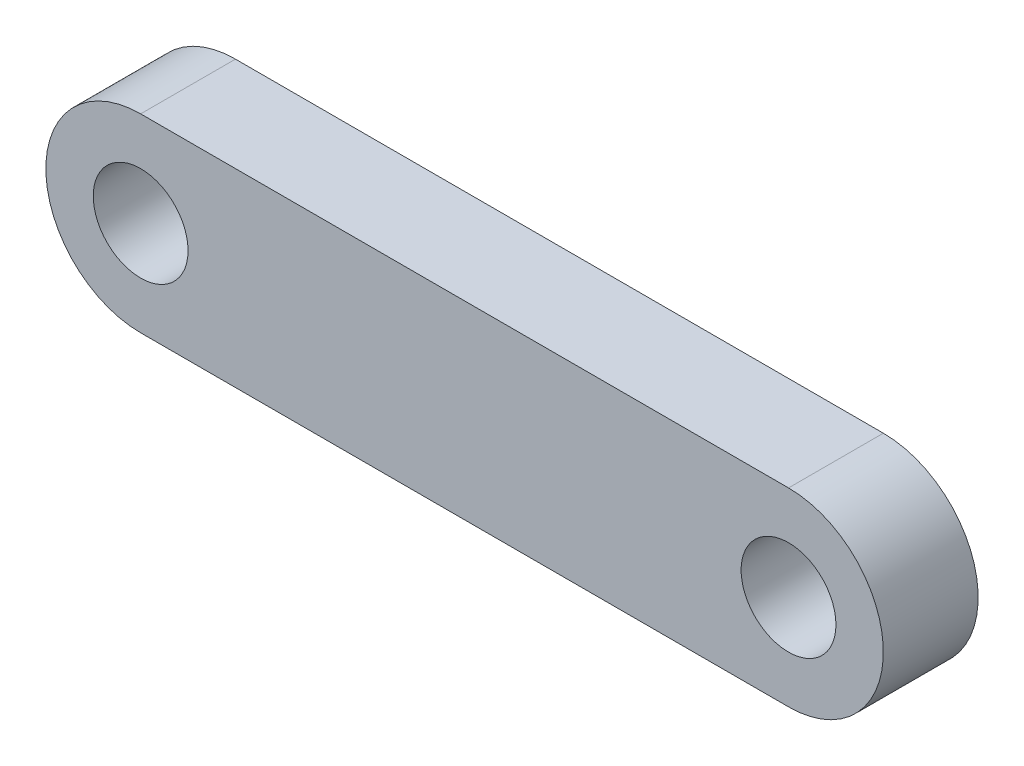
ISO-10303-21;
HEADER;
FILE_DESCRIPTION(('STEP AP214'),'2;1');
FILE_NAME('part.step','',(''),(''),'','','');
FILE_SCHEMA(('AUTOMOTIVE_DESIGN { 1 0 10303 214 1 1 1 1 }'));
ENDSEC;
DATA;
#1=APPLICATION_CONTEXT('core data for automotive mechanical design processes');
#2=APPLICATION_PROTOCOL_DEFINITION('international standard','automotive_design',2000,#1);
#3=PRODUCT_CONTEXT('',#1,'mechanical');
#4=PRODUCT('Part','Part','',(#3));
#5=PRODUCT_RELATED_PRODUCT_CATEGORY('part','',(#4));
#6=PRODUCT_DEFINITION_FORMATION('','',#4);
#7=PRODUCT_DEFINITION_CONTEXT('part definition',#1,'design');
#8=PRODUCT_DEFINITION('design','',#6,#7);
#9=PRODUCT_DEFINITION_SHAPE('','',#8);
#10=(LENGTH_UNIT() NAMED_UNIT(*) SI_UNIT(.MILLI.,.METRE.));
#11=(NAMED_UNIT(*) PLANE_ANGLE_UNIT() SI_UNIT($,.RADIAN.));
#12=(NAMED_UNIT(*) SI_UNIT($,.STERADIAN.) SOLID_ANGLE_UNIT());
#13=UNCERTAINTY_MEASURE_WITH_UNIT(LENGTH_MEASURE(1.E-05),#10,'distance_accuracy_value','');
#14=(GEOMETRIC_REPRESENTATION_CONTEXT(3) GLOBAL_UNCERTAINTY_ASSIGNED_CONTEXT((#13)) GLOBAL_UNIT_ASSIGNED_CONTEXT((#10,
#11,#12)) REPRESENTATION_CONTEXT('',''));
#15=CARTESIAN_POINT('',(0.,0.,0.));
#16=DIRECTION('',(0.,0.,1.));
#17=DIRECTION('',(1.,0.,0.));
#18=AXIS2_PLACEMENT_3D('',#15,#16,#17);
#19=CARTESIAN_POINT('',(0.,0.,3.));
#20=DIRECTION('',(0.,0.,1.));
#21=DIRECTION('',(1.,0.,0.));
#22=AXIS2_PLACEMENT_3D('',#19,#20,#21);
#23=PLANE('',#22);
#24=CARTESIAN_POINT('',(0.,0.,3.));
#25=DIRECTION('',(0.,0.,1.));
#26=DIRECTION('',(1.,0.,0.));
#27=AXIS2_PLACEMENT_3D('',#24,#25,#26);
#28=CIRCLE('',#27,1.5);
#29=CARTESIAN_POINT('',(1.5,0.,3.));
#30=VERTEX_POINT('',#29);
#31=EDGE_CURVE('E101',#30,#30,#28,.T.);
#32=ORIENTED_EDGE('',*,*,#31,.F.);
#33=EDGE_LOOP('',(#32));
#34=FACE_BOUND('',#33,.T.);
#35=CARTESIAN_POINT('',(0.,0.,3.));
#36=DIRECTION('',(0.,0.,1.));
#37=DIRECTION('',(1.,0.,0.));
#38=AXIS2_PLACEMENT_3D('',#35,#36,#37);
#39=CIRCLE('',#38,3.);
#40=CARTESIAN_POINT('',(0.,3.,3.));
#41=VERTEX_POINT('',#40);
#42=CARTESIAN_POINT('',(0.,-3.,3.));
#43=VERTEX_POINT('',#42);
#44=EDGE_CURVE('E86',#41,#43,#39,.T.);
#45=ORIENTED_EDGE('',*,*,#44,.T.);
#46=DIRECTION('',(1.,0.,0.));
#47=VECTOR('',#46,1.);
#48=CARTESIAN_POINT('',(0.,-3.,3.));
#49=LINE('',#48,#47);
#50=CARTESIAN_POINT('',(20.5,-3.,3.));
#51=VERTEX_POINT('',#50);
#52=EDGE_CURVE('E81',#43,#51,#49,.T.);
#53=ORIENTED_EDGE('',*,*,#52,.T.);
#54=CARTESIAN_POINT('',(20.5,0.,3.));
#55=DIRECTION('',(0.,0.,1.));
#56=DIRECTION('',(1.,0.,0.));
#57=AXIS2_PLACEMENT_3D('',#54,#55,#56);
#58=CIRCLE('',#57,3.);
#59=CARTESIAN_POINT('',(20.5,3.,3.));
#60=VERTEX_POINT('',#59);
#61=EDGE_CURVE('E84',#51,#60,#58,.T.);
#62=ORIENTED_EDGE('',*,*,#61,.T.);
#63=DIRECTION('',(-1.,0.,0.));
#64=VECTOR('',#63,1.);
#65=CARTESIAN_POINT('',(0.,3.,3.));
#66=LINE('',#65,#64);
#67=EDGE_CURVE('E51',#60,#41,#66,.T.);
#68=ORIENTED_EDGE('',*,*,#67,.T.);
#69=EDGE_LOOP('',(#45,#53,#62,#68));
#70=FACE_BOUND('',#69,.T.);
#71=CARTESIAN_POINT('',(20.5,0.,3.));
#72=DIRECTION('',(0.,0.,1.));
#73=DIRECTION('',(1.,0.,0.));
#74=AXIS2_PLACEMENT_3D('',#71,#72,#73);
#75=CIRCLE('',#74,1.5);
#76=CARTESIAN_POINT('',(22.,0.,3.));
#77=VERTEX_POINT('',#76);
#78=EDGE_CURVE('E116',#77,#77,#75,.T.);
#79=ORIENTED_EDGE('',*,*,#78,.F.);
#80=EDGE_LOOP('',(#79));
#81=FACE_BOUND('',#80,.T.);
#82=ADVANCED_FACE('F34',(#34,#70,#81),#23,.T.);
#83=CARTESIAN_POINT('',(0.,0.,0.));
#84=DIRECTION('',(0.,0.,1.));
#85=DIRECTION('',(1.,0.,0.));
#86=AXIS2_PLACEMENT_3D('',#83,#84,#85);
#87=PLANE('',#86);
#88=CARTESIAN_POINT('',(0.,0.,0.));
#89=DIRECTION('',(0.,0.,1.));
#90=DIRECTION('',(1.,0.,0.));
#91=AXIS2_PLACEMENT_3D('',#88,#89,#90);
#92=CIRCLE('',#91,3.);
#93=CARTESIAN_POINT('',(0.,3.,0.));
#94=VERTEX_POINT('',#93);
#95=CARTESIAN_POINT('',(0.,-3.,0.));
#96=VERTEX_POINT('',#95);
#97=EDGE_CURVE('E98',#94,#96,#92,.T.);
#98=ORIENTED_EDGE('',*,*,#97,.F.);
#99=DIRECTION('',(-1.,0.,0.));
#100=VECTOR('',#99,1.);
#101=CARTESIAN_POINT('',(0.,3.,0.));
#102=LINE('',#101,#100);
#103=CARTESIAN_POINT('',(20.5,3.,0.));
#104=VERTEX_POINT('',#103);
#105=EDGE_CURVE('E74',#104,#94,#102,.T.);
#106=ORIENTED_EDGE('',*,*,#105,.F.);
#107=CARTESIAN_POINT('',(20.5,0.,0.));
#108=DIRECTION('',(0.,0.,1.));
#109=DIRECTION('',(1.,0.,0.));
#110=AXIS2_PLACEMENT_3D('',#107,#108,#109);
#111=CIRCLE('',#110,3.);
#112=CARTESIAN_POINT('',(20.5,-3.,0.));
#113=VERTEX_POINT('',#112);
#114=EDGE_CURVE('E68',#113,#104,#111,.T.);
#115=ORIENTED_EDGE('',*,*,#114,.F.);
#116=DIRECTION('',(1.,0.,0.));
#117=VECTOR('',#116,1.);
#118=CARTESIAN_POINT('',(0.,-3.,0.));
#119=LINE('',#118,#117);
#120=EDGE_CURVE('E90',#96,#113,#119,.T.);
#121=ORIENTED_EDGE('',*,*,#120,.F.);
#122=EDGE_LOOP('',(#98,#106,#115,#121));
#123=FACE_BOUND('',#122,.T.);
#124=CARTESIAN_POINT('',(0.,0.,0.));
#125=DIRECTION('',(0.,0.,1.));
#126=DIRECTION('',(1.,0.,0.));
#127=AXIS2_PLACEMENT_3D('',#124,#125,#126);
#128=CIRCLE('',#127,1.5);
#129=CARTESIAN_POINT('',(1.5,0.,0.));
#130=VERTEX_POINT('',#129);
#131=EDGE_CURVE('E113',#130,#130,#128,.T.);
#132=ORIENTED_EDGE('',*,*,#131,.T.);
#133=EDGE_LOOP('',(#132));
#134=FACE_BOUND('',#133,.T.);
#135=CARTESIAN_POINT('',(20.5,0.,0.));
#136=DIRECTION('',(0.,0.,1.));
#137=DIRECTION('',(1.,0.,0.));
#138=AXIS2_PLACEMENT_3D('',#135,#136,#137);
#139=CIRCLE('',#138,1.5);
#140=CARTESIAN_POINT('',(22.,0.,0.));
#141=VERTEX_POINT('',#140);
#142=EDGE_CURVE('E119',#141,#141,#139,.T.);
#143=ORIENTED_EDGE('',*,*,#142,.T.);
#144=EDGE_LOOP('',(#143));
#145=FACE_BOUND('',#144,.T.);
#146=ADVANCED_FACE('F109',(#123,#134,#145),#87,.F.);
#147=CARTESIAN_POINT('',(0.,0.,3.));
#148=DIRECTION('',(0.,0.,-1.));
#149=DIRECTION('',(-1.,0.,0.));
#150=AXIS2_PLACEMENT_3D('',#147,#148,#149);
#151=CYLINDRICAL_SURFACE('',#150,3.);
#152=ORIENTED_EDGE('',*,*,#97,.T.);
#153=DIRECTION('',(0.,0.,-1.));
#154=VECTOR('',#153,1.);
#155=CARTESIAN_POINT('',(0.,-3.,3.));
#156=LINE('',#155,#154);
#157=EDGE_CURVE('E11',#43,#96,#156,.T.);
#158=ORIENTED_EDGE('',*,*,#157,.F.);
#159=ORIENTED_EDGE('',*,*,#44,.F.);
#160=DIRECTION('',(0.,0.,-1.));
#161=VECTOR('',#160,1.);
#162=CARTESIAN_POINT('',(0.,3.,3.));
#163=LINE('',#162,#161);
#164=EDGE_CURVE('E94',#41,#94,#163,.T.);
#165=ORIENTED_EDGE('',*,*,#164,.T.);
#166=EDGE_LOOP('',(#152,#158,#159,#165));
#167=FACE_BOUND('',#166,.T.);
#168=ADVANCED_FACE('F36',(#167),#151,.T.);
#169=CARTESIAN_POINT('',(0.,-3.,3.));
#170=DIRECTION('',(0.,1.,0.));
#171=DIRECTION('',(0.,0.,1.));
#172=AXIS2_PLACEMENT_3D('',#169,#170,#171);
#173=PLANE('',#172);
#174=ORIENTED_EDGE('',*,*,#120,.T.);
#175=DIRECTION('',(0.,0.,-1.));
#176=VECTOR('',#175,1.);
#177=CARTESIAN_POINT('',(20.5,-3.,3.));
#178=LINE('',#177,#176);
#179=EDGE_CURVE('E43',#51,#113,#178,.T.);
#180=ORIENTED_EDGE('',*,*,#179,.F.);
#181=ORIENTED_EDGE('',*,*,#52,.F.);
#182=ORIENTED_EDGE('',*,*,#157,.T.);
#183=EDGE_LOOP('',(#174,#180,#181,#182));
#184=FACE_BOUND('',#183,.T.);
#185=ADVANCED_FACE('F89',(#184),#173,.F.);
#186=CARTESIAN_POINT('',(20.5,0.,3.));
#187=DIRECTION('',(0.,0.,-1.));
#188=DIRECTION('',(-1.,0.,0.));
#189=AXIS2_PLACEMENT_3D('',#186,#187,#188);
#190=CYLINDRICAL_SURFACE('',#189,3.);
#191=ORIENTED_EDGE('',*,*,#114,.T.);
#192=DIRECTION('',(0.,0.,-1.));
#193=VECTOR('',#192,1.);
#194=CARTESIAN_POINT('',(20.5,3.,3.));
#195=LINE('',#194,#193);
#196=EDGE_CURVE('E91',#60,#104,#195,.T.);
#197=ORIENTED_EDGE('',*,*,#196,.F.);
#198=ORIENTED_EDGE('',*,*,#61,.F.);
#199=ORIENTED_EDGE('',*,*,#179,.T.);
#200=EDGE_LOOP('',(#191,#197,#198,#199));
#201=FACE_BOUND('',#200,.T.);
#202=ADVANCED_FACE('F92',(#201),#190,.T.);
#203=CARTESIAN_POINT('',(0.,3.,3.));
#204=DIRECTION('',(0.,-1.,0.));
#205=DIRECTION('',(0.,0.,-1.));
#206=AXIS2_PLACEMENT_3D('',#203,#204,#205);
#207=PLANE('',#206);
#208=ORIENTED_EDGE('',*,*,#105,.T.);
#209=ORIENTED_EDGE('',*,*,#164,.F.);
#210=ORIENTED_EDGE('',*,*,#67,.F.);
#211=ORIENTED_EDGE('',*,*,#196,.T.);
#212=EDGE_LOOP('',(#208,#209,#210,#211));
#213=FACE_BOUND('',#212,.T.);
#214=ADVANCED_FACE('F106',(#213),#207,.F.);
#215=CARTESIAN_POINT('',(0.,0.,3.));
#216=DIRECTION('',(0.,0.,-1.));
#217=DIRECTION('',(-1.,0.,0.));
#218=AXIS2_PLACEMENT_3D('',#215,#216,#217);
#219=CYLINDRICAL_SURFACE('',#218,1.5);
#220=ORIENTED_EDGE('',*,*,#31,.T.);
#221=EDGE_LOOP('',(#220));
#222=FACE_BOUND('',#221,.T.);
#223=ORIENTED_EDGE('',*,*,#131,.F.);
#224=EDGE_LOOP('',(#223));
#225=FACE_BOUND('',#224,.T.);
#226=ADVANCED_FACE('F136',(#222,#225),#219,.F.);
#227=CARTESIAN_POINT('',(20.5,0.,3.));
#228=DIRECTION('',(0.,0.,-1.));
#229=DIRECTION('',(-1.,0.,0.));
#230=AXIS2_PLACEMENT_3D('',#227,#228,#229);
#231=CYLINDRICAL_SURFACE('',#230,1.5);
#232=ORIENTED_EDGE('',*,*,#78,.T.);
#233=EDGE_LOOP('',(#232));
#234=FACE_BOUND('',#233,.T.);
#235=ORIENTED_EDGE('',*,*,#142,.F.);
#236=EDGE_LOOP('',(#235));
#237=FACE_BOUND('',#236,.T.);
#238=ADVANCED_FACE('F125',(#234,#237),#231,.F.);
#239=CLOSED_SHELL('',(#82,#146,#168,#185,#202,#214,#226,#238));
#240=MANIFOLD_SOLID_BREP('B2',#239);
#241=ADVANCED_BREP_SHAPE_REPRESENTATION('',(#18,#240),#14);
#242=SHAPE_DEFINITION_REPRESENTATION(#9,#241);
ENDSEC;
END-ISO-10303-21;
